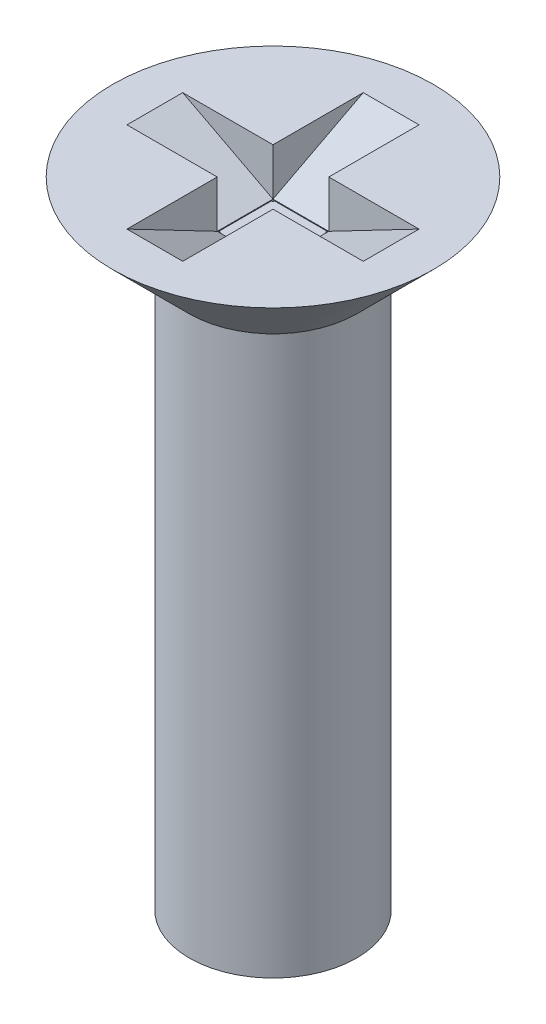
ISO-10303-21;
HEADER;
FILE_DESCRIPTION(('STEP AP214'),'2;1');
FILE_NAME('part.step','',(''),(''),'','','');
FILE_SCHEMA(('AUTOMOTIVE_DESIGN { 1 0 10303 214 1 1 1 1 }'));
ENDSEC;
DATA;
#1=APPLICATION_CONTEXT('core data for automotive mechanical design processes');
#2=APPLICATION_PROTOCOL_DEFINITION('international standard','automotive_design',2000,#1);
#3=PRODUCT_CONTEXT('',#1,'mechanical');
#4=PRODUCT('Part','Part','',(#3));
#5=PRODUCT_RELATED_PRODUCT_CATEGORY('part','',(#4));
#6=PRODUCT_DEFINITION_FORMATION('','',#4);
#7=PRODUCT_DEFINITION_CONTEXT('part definition',#1,'design');
#8=PRODUCT_DEFINITION('design','',#6,#7);
#9=PRODUCT_DEFINITION_SHAPE('','',#8);
#10=(LENGTH_UNIT() NAMED_UNIT(*) SI_UNIT(.MILLI.,.METRE.));
#11=(NAMED_UNIT(*) PLANE_ANGLE_UNIT() SI_UNIT($,.RADIAN.));
#12=(NAMED_UNIT(*) SI_UNIT($,.STERADIAN.) SOLID_ANGLE_UNIT());
#13=UNCERTAINTY_MEASURE_WITH_UNIT(LENGTH_MEASURE(1.E-05),#10,'distance_accuracy_value','');
#14=(GEOMETRIC_REPRESENTATION_CONTEXT(3) GLOBAL_UNCERTAINTY_ASSIGNED_CONTEXT((#13)) GLOBAL_UNIT_ASSIGNED_CONTEXT((#10,
#11,#12)) REPRESENTATION_CONTEXT('',''));
#15=CARTESIAN_POINT('',(0.,0.,0.));
#16=DIRECTION('',(0.,0.,1.));
#17=DIRECTION('',(1.,0.,0.));
#18=AXIS2_PLACEMENT_3D('',#15,#16,#17);
#19=CARTESIAN_POINT('',(-0.472629214597488,0.51696318340299,-0.5));
#20=DIRECTION('',(-0.462439307727369,-0.886650938458101,0.));
#21=DIRECTION('',(0.886650938458101,-0.462439307727369,0.));
#22=AXIS2_PLACEMENT_3D('',#19,#20,#21);
#23=PLANE('',#22);
#24=DIRECTION('',(0.,0.,-1.));
#25=VECTOR('',#24,1.);
#26=CARTESIAN_POINT('',(-0.499999999999995,0.53123861751633,0.499999999999978));
#27=LINE('',#26,#25);
#28=CARTESIAN_POINT('',(-0.499999999999995,0.531238617516331,0.5));
#29=VERTEX_POINT('',#28);
#30=CARTESIAN_POINT('',(-0.500000000000002,0.531238617516334,-0.500000000000001));
#31=VERTEX_POINT('',#30);
#32=EDGE_CURVE('E546',#29,#31,#27,.T.);
#33=ORIENTED_EDGE('',*,*,#32,.T.);
#34=DIRECTION('',(0.886650938458101,-0.462439307727369,0.));
#35=VECTOR('',#34,1.);
#36=CARTESIAN_POINT('',(-0.472629214597488,0.51696318340299,-0.5));
#37=LINE('',#36,#35);
#38=CARTESIAN_POINT('',(-2.11777299012585,1.37499999999998,-0.5));
#39=VERTEX_POINT('',#38);
#40=EDGE_CURVE('E495',#39,#31,#37,.T.);
#41=ORIENTED_EDGE('',*,*,#40,.F.);
#42=DIRECTION('',(0.,0.,1.));
#43=VECTOR('',#42,1.);
#44=CARTESIAN_POINT('',(-2.11777299012585,1.37499999999998,-0.5));
#45=LINE('',#44,#43);
#46=CARTESIAN_POINT('',(-2.11777299012585,1.37499999999999,0.5));
#47=VERTEX_POINT('',#46);
#48=EDGE_CURVE('E177',#39,#47,#45,.T.);
#49=ORIENTED_EDGE('',*,*,#48,.T.);
#50=DIRECTION('',(0.886650938458101,-0.462439307727369,0.));
#51=VECTOR('',#50,1.);
#52=CARTESIAN_POINT('',(-0.472629214597488,0.51696318340299,0.5));
#53=LINE('',#52,#51);
#54=EDGE_CURVE('E490',#47,#29,#53,.T.);
#55=ORIENTED_EDGE('',*,*,#54,.T.);
#56=EDGE_LOOP('',(#33,#41,#49,#55));
#57=FACE_BOUND('',#56,.T.);
#58=ADVANCED_FACE('F34',(#57),#23,.F.);
#59=CARTESIAN_POINT('',(0.,0.,-0.5));
#60=DIRECTION('',(0.,0.,1.));
#61=DIRECTION('',(1.,0.,0.));
#62=AXIS2_PLACEMENT_3D('',#59,#60,#61);
#63=PLANE('',#62);
#64=ORIENTED_EDGE('',*,*,#40,.T.);
#65=DIRECTION('',(0.,1.,0.));
#66=VECTOR('',#65,1.);
#67=CARTESIAN_POINT('',(-0.500000000000005,0.,-0.5));
#68=LINE('',#67,#66);
#69=CARTESIAN_POINT('',(-0.500000000000002,1.37499999999998,-0.499999999999999));
#70=VERTEX_POINT('',#69);
#71=EDGE_CURVE('E529',#31,#70,#68,.T.);
#72=ORIENTED_EDGE('',*,*,#71,.T.);
#73=DIRECTION('',(-1.,0.,0.));
#74=VECTOR('',#73,1.);
#75=CARTESIAN_POINT('',(-2.11777299012585,1.37499999999998,-0.5));
#76=LINE('',#75,#74);
#77=EDGE_CURVE('E169',#70,#39,#76,.T.);
#78=ORIENTED_EDGE('',*,*,#77,.T.);
#79=EDGE_LOOP('',(#64,#72,#78));
#80=FACE_BOUND('',#79,.T.);
#81=ADVANCED_FACE('F196',(#80),#63,.T.);
#82=DIRECTION('',(0.,1.,0.));
#83=VECTOR('',#82,1.);
#84=CARTESIAN_POINT('',(0.499999999999995,0.,-0.5));
#85=LINE('',#84,#83);
#86=CARTESIAN_POINT('',(0.499999999999995,0.53123861751633,-0.5));
#87=VERTEX_POINT('',#86);
#88=CARTESIAN_POINT('',(0.499999999999998,1.37499999999998,-0.499999999999999));
#89=VERTEX_POINT('',#88);
#90=EDGE_CURVE('E464',#87,#89,#85,.T.);
#91=ORIENTED_EDGE('',*,*,#90,.F.);
#92=DIRECTION('',(0.886650938458101,0.462439307727369,0.));
#93=VECTOR('',#92,1.);
#94=CARTESIAN_POINT('',(2.11777299012585,1.37499999999998,-0.5));
#95=LINE('',#94,#93);
#96=CARTESIAN_POINT('',(2.11777299012585,1.37499999999998,-0.5));
#97=VERTEX_POINT('',#96);
#98=EDGE_CURVE('E466',#87,#97,#95,.T.);
#99=ORIENTED_EDGE('',*,*,#98,.T.);
#100=EDGE_CURVE('E164',#97,#89,#76,.T.);
#101=ORIENTED_EDGE('',*,*,#100,.T.);
#102=EDGE_LOOP('',(#91,#99,#101));
#103=FACE_BOUND('',#102,.T.);
#104=ADVANCED_FACE('F203',(#103),#63,.T.);
#105=CARTESIAN_POINT('',(0.,0.,0.5));
#106=DIRECTION('',(0.,0.,1.));
#107=DIRECTION('',(1.,0.,0.));
#108=AXIS2_PLACEMENT_3D('',#105,#106,#107);
#109=PLANE('',#108);
#110=DIRECTION('',(0.,1.,0.));
#111=VECTOR('',#110,1.);
#112=CARTESIAN_POINT('',(-0.499999999999995,0.,0.5));
#113=LINE('',#112,#111);
#114=CARTESIAN_POINT('',(-0.499999999999994,1.37499999999998,0.5));
#115=VERTEX_POINT('',#114);
#116=EDGE_CURVE('E544',#29,#115,#113,.T.);
#117=ORIENTED_EDGE('',*,*,#116,.F.);
#118=ORIENTED_EDGE('',*,*,#54,.F.);
#119=DIRECTION('',(-1.,0.,0.));
#120=VECTOR('',#119,1.);
#121=CARTESIAN_POINT('',(-2.11777299012585,1.37499999999998,0.5));
#122=LINE('',#121,#120);
#123=EDGE_CURVE('E484',#115,#47,#122,.T.);
#124=ORIENTED_EDGE('',*,*,#123,.F.);
#125=EDGE_LOOP('',(#117,#118,#124));
#126=FACE_BOUND('',#125,.T.);
#127=ADVANCED_FACE('F247',(#126),#109,.F.);
#128=DIRECTION('',(0.886650938458101,0.462439307727369,0.));
#129=VECTOR('',#128,1.);
#130=CARTESIAN_POINT('',(2.11777299012585,1.37499999999998,0.5));
#131=LINE('',#130,#129);
#132=CARTESIAN_POINT('',(0.500000000000005,0.531238617516336,0.5));
#133=VERTEX_POINT('',#132);
#134=CARTESIAN_POINT('',(2.11777299012585,1.37499999999998,0.5));
#135=VERTEX_POINT('',#134);
#136=EDGE_CURVE('E474',#133,#135,#131,.T.);
#137=ORIENTED_EDGE('',*,*,#136,.F.);
#138=DIRECTION('',(0.,1.,0.));
#139=VECTOR('',#138,1.);
#140=CARTESIAN_POINT('',(0.500000000000005,0.,0.5));
#141=LINE('',#140,#139);
#142=CARTESIAN_POINT('',(0.500000000000002,1.37499999999998,0.5));
#143=VERTEX_POINT('',#142);
#144=EDGE_CURVE('E538',#133,#143,#141,.T.);
#145=ORIENTED_EDGE('',*,*,#144,.T.);
#146=EDGE_CURVE('E481',#135,#143,#122,.T.);
#147=ORIENTED_EDGE('',*,*,#146,.F.);
#148=EDGE_LOOP('',(#137,#145,#147));
#149=FACE_BOUND('',#148,.T.);
#150=ADVANCED_FACE('F248',(#149),#109,.F.);
#151=CARTESIAN_POINT('',(0.,1.37499999999999,0.));
#152=DIRECTION('',(0.,1.,0.));
#153=DIRECTION('',(0.,0.,1.));
#154=AXIS2_PLACEMENT_3D('',#151,#152,#153);
#155=PLANE('',#154);
#156=DIRECTION('',(0.,0.,1.));
#157=VECTOR('',#156,1.);
#158=CARTESIAN_POINT('',(0.500000000000007,1.37499999999998,2.11777299012585));
#159=LINE('',#158,#157);
#160=CARTESIAN_POINT('',(0.499999999999993,1.37499999999998,-2.11777299012586));
#161=VERTEX_POINT('',#160);
#162=EDGE_CURVE('E454',#161,#89,#159,.T.);
#163=ORIENTED_EDGE('',*,*,#162,.T.);
#164=ORIENTED_EDGE('',*,*,#100,.F.);
#165=DIRECTION('',(0.,0.,1.));
#166=VECTOR('',#165,1.);
#167=CARTESIAN_POINT('',(2.11777299012585,1.37499999999998,-0.5));
#168=LINE('',#167,#166);
#169=EDGE_CURVE('E472',#97,#135,#168,.T.);
#170=ORIENTED_EDGE('',*,*,#169,.T.);
#171=ORIENTED_EDGE('',*,*,#146,.T.);
#172=CARTESIAN_POINT('',(0.500000000000007,1.37499999999998,2.11777299012585));
#173=VERTEX_POINT('',#172);
#174=EDGE_CURVE('E461',#143,#173,#159,.T.);
#175=ORIENTED_EDGE('',*,*,#174,.T.);
#176=DIRECTION('',(1.,0.,0.));
#177=VECTOR('',#176,1.);
#178=CARTESIAN_POINT('',(-0.499999999999993,1.37499999999998,2.11777299012586));
#179=LINE('',#178,#177);
#180=CARTESIAN_POINT('',(-0.499999999999993,1.37499999999998,2.11777299012586));
#181=VERTEX_POINT('',#180);
#182=EDGE_CURVE('E501',#181,#173,#179,.T.);
#183=ORIENTED_EDGE('',*,*,#182,.F.);
#184=DIRECTION('',(0.,0.,1.));
#185=VECTOR('',#184,1.);
#186=CARTESIAN_POINT('',(-0.499999999999993,1.37499999999998,2.11777299012586));
#187=LINE('',#186,#185);
#188=EDGE_CURVE('E515',#115,#181,#187,.T.);
#189=ORIENTED_EDGE('',*,*,#188,.F.);
#190=ORIENTED_EDGE('',*,*,#123,.T.);
#191=ORIENTED_EDGE('',*,*,#48,.F.);
#192=ORIENTED_EDGE('',*,*,#77,.F.);
#193=CARTESIAN_POINT('',(-0.500000000000007,1.37499999999998,-2.11777299012585));
#194=VERTEX_POINT('',#193);
#195=EDGE_CURVE('E513',#194,#70,#187,.T.);
#196=ORIENTED_EDGE('',*,*,#195,.F.);
#197=DIRECTION('',(1.,0.,0.));
#198=VECTOR('',#197,1.);
#199=CARTESIAN_POINT('',(-0.500000000000007,1.37499999999998,-2.11777299012585));
#200=LINE('',#199,#198);
#201=EDGE_CURVE('E459',#194,#161,#200,.T.);
#202=ORIENTED_EDGE('',*,*,#201,.T.);
#203=EDGE_LOOP('',(#163,#164,#170,#171,#175,#183,#189,#190,#191,#192,#196,#202));
#204=FACE_BOUND('',#203,.T.);
#205=CARTESIAN_POINT('',(0.,1.37499999999998,0.));
#206=DIRECTION('',(0.,1.,0.));
#207=DIRECTION('',(0.,0.,1.));
#208=AXIS2_PLACEMENT_3D('',#205,#206,#207);
#209=CIRCLE('',#208,2.875);
#210=CARTESIAN_POINT('',(0.,1.37499999999998,2.875));
#211=VERTEX_POINT('',#210);
#212=EDGE_CURVE('E11',#211,#211,#209,.T.);
#213=ORIENTED_EDGE('',*,*,#212,.T.);
#214=EDGE_LOOP('',(#213));
#215=FACE_BOUND('',#214,.T.);
#216=ADVANCED_FACE('F193',(#204,#215),#155,.T.);
#217=CARTESIAN_POINT('',(0.,1.37499999999998,0.));
#218=DIRECTION('',(0.,1.,0.));
#219=DIRECTION('',(0.,0.,1.));
#220=AXIS2_PLACEMENT_3D('',#217,#218,#219);
#221=CONICAL_SURFACE('',#220,2.875,0.785398163397454);
#222=CARTESIAN_POINT('',(0.,0.,0.));
#223=DIRECTION('',(0.,1.,0.));
#224=DIRECTION('',(0.,0.,1.));
#225=AXIS2_PLACEMENT_3D('',#222,#223,#224);
#226=CIRCLE('',#225,1.5);
#227=CARTESIAN_POINT('',(0.,0.,1.5));
#228=VERTEX_POINT('',#227);
#229=EDGE_CURVE('E175',#228,#228,#226,.T.);
#230=ORIENTED_EDGE('',*,*,#229,.T.);
#231=EDGE_LOOP('',(#230));
#232=FACE_BOUND('',#231,.T.);
#233=ORIENTED_EDGE('',*,*,#212,.F.);
#234=EDGE_LOOP('',(#233));
#235=FACE_BOUND('',#234,.T.);
#236=ADVANCED_FACE('F36',(#232,#235),#221,.T.);
#237=CARTESIAN_POINT('',(-1.5,-10.,0.));
#238=DIRECTION('',(0.,-1.,0.));
#239=DIRECTION('',(0.,0.,-1.));
#240=AXIS2_PLACEMENT_3D('',#237,#238,#239);
#241=PLANE('',#240);
#242=CARTESIAN_POINT('',(0.,-10.,0.));
#243=DIRECTION('',(0.,1.,0.));
#244=DIRECTION('',(0.,0.,1.));
#245=AXIS2_PLACEMENT_3D('',#242,#243,#244);
#246=CIRCLE('',#245,1.5);
#247=CARTESIAN_POINT('',(0.,-10.,1.5));
#248=VERTEX_POINT('',#247);
#249=EDGE_CURVE('E42',#248,#248,#246,.T.);
#250=ORIENTED_EDGE('',*,*,#249,.F.);
#251=EDGE_LOOP('',(#250));
#252=FACE_BOUND('',#251,.T.);
#253=ADVANCED_FACE('F184',(#252),#241,.T.);
#254=CARTESIAN_POINT('',(0.,0.,0.));
#255=DIRECTION('',(0.,1.,0.));
#256=DIRECTION('',(0.,0.,1.));
#257=AXIS2_PLACEMENT_3D('',#254,#255,#256);
#258=CYLINDRICAL_SURFACE('',#257,1.5);
#259=ORIENTED_EDGE('',*,*,#249,.T.);
#260=EDGE_LOOP('',(#259));
#261=FACE_BOUND('',#260,.T.);
#262=ORIENTED_EDGE('',*,*,#229,.F.);
#263=EDGE_LOOP('',(#262));
#264=FACE_BOUND('',#263,.T.);
#265=ADVANCED_FACE('F181',(#261,#264),#258,.T.);
#266=CARTESIAN_POINT('',(2.11777299012585,1.37499999999998,-0.5));
#267=DIRECTION('',(0.462439307727369,-0.886650938458101,0.));
#268=DIRECTION('',(0.886650938458101,0.462439307727369,0.));
#269=AXIS2_PLACEMENT_3D('',#266,#267,#268);
#270=PLANE('',#269);
#271=ORIENTED_EDGE('',*,*,#98,.F.);
#272=DIRECTION('',(0.,0.,-1.));
#273=VECTOR('',#272,1.);
#274=CARTESIAN_POINT('',(0.500000000000005,0.531238617516336,0.5));
#275=LINE('',#274,#273);
#276=EDGE_CURVE('E541',#133,#87,#275,.T.);
#277=ORIENTED_EDGE('',*,*,#276,.F.);
#278=ORIENTED_EDGE('',*,*,#136,.T.);
#279=ORIENTED_EDGE('',*,*,#169,.F.);
#280=EDGE_LOOP('',(#271,#277,#278,#279));
#281=FACE_BOUND('',#280,.T.);
#282=ADVANCED_FACE('F191',(#281),#270,.F.);
#283=CARTESIAN_POINT('',(-0.499999999999998,0.51696318340299,0.47262921459749));
#284=DIRECTION('',(0.,-0.886650938458101,0.462439307727369));
#285=DIRECTION('',(0.,-0.462439307727369,-0.886650938458101));
#286=AXIS2_PLACEMENT_3D('',#283,#284,#285);
#287=PLANE('',#286);
#288=DIRECTION('',(0.,-0.462439307727369,-0.886650938458101));
#289=VECTOR('',#288,1.);
#290=CARTESIAN_POINT('',(-0.499999999999998,0.51696318340299,0.47262921459749));
#291=LINE('',#290,#289);
#292=EDGE_CURVE('E520',#181,#29,#291,.T.);
#293=ORIENTED_EDGE('',*,*,#292,.F.);
#294=ORIENTED_EDGE('',*,*,#182,.T.);
#295=DIRECTION('',(0.,-0.462439307727369,-0.886650938458101));
#296=VECTOR('',#295,1.);
#297=CARTESIAN_POINT('',(0.500000000000002,0.51696318340299,0.472629214597486));
#298=LINE('',#297,#296);
#299=EDGE_CURVE('E509',#173,#133,#298,.T.);
#300=ORIENTED_EDGE('',*,*,#299,.T.);
#301=DIRECTION('',(-1.,0.,0.));
#302=VECTOR('',#301,1.);
#303=CARTESIAN_POINT('',(0.,0.531238617516333,0.5));
#304=LINE('',#303,#302);
#305=EDGE_CURVE('E523',#133,#29,#304,.T.);
#306=ORIENTED_EDGE('',*,*,#305,.T.);
#307=EDGE_LOOP('',(#293,#294,#300,#306));
#308=FACE_BOUND('',#307,.T.);
#309=ADVANCED_FACE('F282',(#308),#287,.F.);
#310=CARTESIAN_POINT('',(-0.5,0.,0.));
#311=DIRECTION('',(1.,0.,0.));
#312=DIRECTION('',(0.,0.,-1.));
#313=AXIS2_PLACEMENT_3D('',#310,#311,#312);
#314=PLANE('',#313);
#315=ORIENTED_EDGE('',*,*,#116,.T.);
#316=ORIENTED_EDGE('',*,*,#188,.T.);
#317=ORIENTED_EDGE('',*,*,#292,.T.);
#318=EDGE_LOOP('',(#315,#316,#317));
#319=FACE_BOUND('',#318,.T.);
#320=ADVANCED_FACE('F264',(#319),#314,.T.);
#321=CARTESIAN_POINT('',(0.5,0.,0.));
#322=DIRECTION('',(1.,0.,0.));
#323=DIRECTION('',(0.,0.,-1.));
#324=AXIS2_PLACEMENT_3D('',#321,#322,#323);
#325=PLANE('',#324);
#326=ORIENTED_EDGE('',*,*,#299,.F.);
#327=ORIENTED_EDGE('',*,*,#174,.F.);
#328=ORIENTED_EDGE('',*,*,#144,.F.);
#329=EDGE_LOOP('',(#326,#327,#328));
#330=FACE_BOUND('',#329,.T.);
#331=ADVANCED_FACE('F303',(#330),#325,.F.);
#332=CARTESIAN_POINT('',(-0.500000000000007,1.37499999999998,-2.11777299012585));
#333=DIRECTION('',(0.,-0.886650938458101,-0.462439307727369));
#334=DIRECTION('',(0.,0.462439307727369,-0.886650938458101));
#335=AXIS2_PLACEMENT_3D('',#332,#333,#334);
#336=PLANE('',#335);
#337=DIRECTION('',(-1.,0.,0.));
#338=VECTOR('',#337,1.);
#339=CARTESIAN_POINT('',(0.,0.531238617516333,-0.5));
#340=LINE('',#339,#338);
#341=EDGE_CURVE('E526',#87,#31,#340,.T.);
#342=ORIENTED_EDGE('',*,*,#341,.F.);
#343=DIRECTION('',(0.,0.462439307727369,-0.886650938458101));
#344=VECTOR('',#343,1.);
#345=CARTESIAN_POINT('',(0.499999999999993,1.37499999999998,-2.11777299012586));
#346=LINE('',#345,#344);
#347=EDGE_CURVE('E505',#87,#161,#346,.T.);
#348=ORIENTED_EDGE('',*,*,#347,.T.);
#349=ORIENTED_EDGE('',*,*,#201,.F.);
#350=DIRECTION('',(0.,0.462439307727369,-0.886650938458101));
#351=VECTOR('',#350,1.);
#352=CARTESIAN_POINT('',(-0.500000000000007,1.37499999999998,-2.11777299012585));
#353=LINE('',#352,#351);
#354=EDGE_CURVE('E49',#31,#194,#353,.T.);
#355=ORIENTED_EDGE('',*,*,#354,.F.);
#356=EDGE_LOOP('',(#342,#348,#349,#355));
#357=FACE_BOUND('',#356,.T.);
#358=ADVANCED_FACE('F273',(#357),#336,.F.);
#359=ORIENTED_EDGE('',*,*,#354,.T.);
#360=ORIENTED_EDGE('',*,*,#195,.T.);
#361=ORIENTED_EDGE('',*,*,#71,.F.);
#362=EDGE_LOOP('',(#359,#360,#361));
#363=FACE_BOUND('',#362,.T.);
#364=ADVANCED_FACE('F265',(#363),#314,.T.);
#365=ORIENTED_EDGE('',*,*,#90,.T.);
#366=ORIENTED_EDGE('',*,*,#162,.F.);
#367=ORIENTED_EDGE('',*,*,#347,.F.);
#368=EDGE_LOOP('',(#365,#366,#367));
#369=FACE_BOUND('',#368,.T.);
#370=ADVANCED_FACE('F300',(#369),#325,.F.);
#371=ORIENTED_EDGE('',*,*,#276,.T.);
#372=CARTESIAN_POINT('',(0.499999999999998,0.51696318340299,-0.47262921459749));
#373=VERTEX_POINT('',#372);
#374=EDGE_CURVE('E503',#373,#87,#346,.T.);
#375=ORIENTED_EDGE('',*,*,#374,.F.);
#376=DIRECTION('',(0.,0.,-1.));
#377=VECTOR('',#376,1.);
#378=CARTESIAN_POINT('',(0.499999999999998,0.51696318340299,-0.47262921459749));
#379=LINE('',#378,#377);
#380=CARTESIAN_POINT('',(0.500000000000002,0.51696318340299,0.472629214597486));
#381=VERTEX_POINT('',#380);
#382=EDGE_CURVE('E506',#381,#373,#379,.T.);
#383=ORIENTED_EDGE('',*,*,#382,.F.);
#384=EDGE_CURVE('E512',#133,#381,#298,.T.);
#385=ORIENTED_EDGE('',*,*,#384,.F.);
#386=EDGE_LOOP('',(#371,#375,#383,#385));
#387=FACE_BOUND('',#386,.T.);
#388=ADVANCED_FACE('F294',(#387),#325,.F.);
#389=DIRECTION('',(-0.663427894457714,-0.346015689977808,-0.663427894457707));
#390=VECTOR('',#389,1.);
#391=CARTESIAN_POINT('',(0.484676098234086,0.523246324025239,0.484676098234081));
#392=LINE('',#391,#390);
#393=CARTESIAN_POINT('',(0.472629214597488,0.51696318340299,0.472629214597488));
#394=VERTEX_POINT('',#393);
#395=EDGE_CURVE('E57',#133,#394,#392,.T.);
#396=ORIENTED_EDGE('',*,*,#395,.F.);
#397=ORIENTED_EDGE('',*,*,#384,.T.);
#398=DIRECTION('',(1.,0.,0.));
#399=VECTOR('',#398,1.);
#400=CARTESIAN_POINT('',(-0.499999999999998,0.51696318340299,0.47262921459749));
#401=LINE('',#400,#399);
#402=EDGE_CURVE('E158',#394,#381,#401,.T.);
#403=ORIENTED_EDGE('',*,*,#402,.F.);
#404=EDGE_LOOP('',(#396,#397,#403));
#405=FACE_BOUND('',#404,.T.);
#406=ADVANCED_FACE('F281',(#405),#287,.F.);
#407=DIRECTION('',(0.663427894457708,0.346015689977805,-0.663427894457715));
#408=VECTOR('',#407,1.);
#409=CARTESIAN_POINT('',(0.04453952708949,0.293689863373928,-0.0445395270894905));
#410=LINE('',#409,#408);
#411=CARTESIAN_POINT('',(0.472629214597488,0.51696318340299,-0.472629214597489));
#412=VERTEX_POINT('',#411);
#413=EDGE_CURVE('E149',#412,#87,#410,.T.);
#414=ORIENTED_EDGE('',*,*,#413,.F.);
#415=DIRECTION('',(1.,0.,0.));
#416=VECTOR('',#415,1.);
#417=CARTESIAN_POINT('',(-0.500000000000002,0.51696318340299,-0.472629214597486));
#418=LINE('',#417,#416);
#419=EDGE_CURVE('E157',#412,#373,#418,.T.);
#420=ORIENTED_EDGE('',*,*,#419,.T.);
#421=ORIENTED_EDGE('',*,*,#374,.T.);
#422=EDGE_LOOP('',(#414,#420,#421));
#423=FACE_BOUND('',#422,.T.);
#424=ADVANCED_FACE('F274',(#423),#336,.F.);
#425=DIRECTION('',(-0.663427894457708,0.346015689977805,0.663427894457715));
#426=VECTOR('',#425,1.);
#427=CARTESIAN_POINT('',(-1.40573193336152,1.0036297582494,1.40573193336153));
#428=LINE('',#427,#426);
#429=CARTESIAN_POINT('',(-0.472629214597488,0.51696318340299,0.472629214597493));
#430=VERTEX_POINT('',#429);
#431=EDGE_CURVE('E138',#430,#29,#428,.T.);
#432=ORIENTED_EDGE('',*,*,#431,.F.);
#433=CARTESIAN_POINT('',(-0.499999999999998,0.51696318340299,0.47262921459749));
#434=VERTEX_POINT('',#433);
#435=EDGE_CURVE('E141',#434,#430,#401,.T.);
#436=ORIENTED_EDGE('',*,*,#435,.F.);
#437=EDGE_CURVE('E143',#29,#434,#291,.T.);
#438=ORIENTED_EDGE('',*,*,#437,.F.);
#439=EDGE_LOOP('',(#432,#436,#438));
#440=FACE_BOUND('',#439,.T.);
#441=ADVANCED_FACE('F140',(#440),#287,.F.);
#442=DIRECTION('',(0.663427894457714,-0.346015689977808,0.663427894457707));
#443=VECTOR('',#442,1.);
#444=CARTESIAN_POINT('',(-0.965595362216948,0.774073297598108,-0.965595362216937));
#445=LINE('',#444,#443);
#446=CARTESIAN_POINT('',(-0.472629214597488,0.51696318340299,-0.472629214597488));
#447=VERTEX_POINT('',#446);
#448=EDGE_CURVE('E535',#31,#447,#445,.T.);
#449=ORIENTED_EDGE('',*,*,#448,.F.);
#450=CARTESIAN_POINT('',(-0.500000000000002,0.51696318340299,-0.472629214597486));
#451=VERTEX_POINT('',#450);
#452=EDGE_CURVE('E516',#451,#31,#353,.T.);
#453=ORIENTED_EDGE('',*,*,#452,.F.);
#454=EDGE_CURVE('E498',#451,#447,#418,.T.);
#455=ORIENTED_EDGE('',*,*,#454,.T.);
#456=EDGE_LOOP('',(#449,#453,#455));
#457=FACE_BOUND('',#456,.T.);
#458=ADVANCED_FACE('F261',(#457),#336,.F.);
#459=ORIENTED_EDGE('',*,*,#437,.T.);
#460=DIRECTION('',(0.,0.,-1.));
#461=VECTOR('',#460,1.);
#462=CARTESIAN_POINT('',(-0.500000000000002,0.51696318340299,-0.472629214597486));
#463=LINE('',#462,#461);
#464=EDGE_CURVE('E156',#434,#451,#463,.T.);
#465=ORIENTED_EDGE('',*,*,#464,.T.);
#466=ORIENTED_EDGE('',*,*,#452,.T.);
#467=ORIENTED_EDGE('',*,*,#32,.F.);
#468=EDGE_LOOP('',(#459,#465,#466,#467));
#469=FACE_BOUND('',#468,.T.);
#470=ADVANCED_FACE('F254',(#469),#314,.T.);
#471=ORIENTED_EDGE('',*,*,#341,.T.);
#472=CARTESIAN_POINT('',(-0.472629214597488,0.51696318340299,-0.5));
#473=VERTEX_POINT('',#472);
#474=EDGE_CURVE('E483',#31,#473,#37,.T.);
#475=ORIENTED_EDGE('',*,*,#474,.T.);
#476=DIRECTION('',(1.,0.,0.));
#477=VECTOR('',#476,1.);
#478=CARTESIAN_POINT('',(0.472629214597488,0.51696318340299,-0.5));
#479=LINE('',#478,#477);
#480=CARTESIAN_POINT('',(0.472629214597488,0.51696318340299,-0.5));
#481=VERTEX_POINT('',#480);
#482=EDGE_CURVE('E470',#473,#481,#479,.T.);
#483=ORIENTED_EDGE('',*,*,#482,.T.);
#484=EDGE_CURVE('E469',#481,#87,#95,.T.);
#485=ORIENTED_EDGE('',*,*,#484,.T.);
#486=EDGE_LOOP('',(#471,#475,#483,#485));
#487=FACE_BOUND('',#486,.T.);
#488=ADVANCED_FACE('F206',(#487),#63,.T.);
#489=CARTESIAN_POINT('',(-0.472629214597488,0.51696318340299,0.5));
#490=VERTEX_POINT('',#489);
#491=EDGE_CURVE('E161',#29,#490,#53,.T.);
#492=ORIENTED_EDGE('',*,*,#491,.F.);
#493=ORIENTED_EDGE('',*,*,#305,.F.);
#494=CARTESIAN_POINT('',(0.472629214597488,0.51696318340299,0.5));
#495=VERTEX_POINT('',#494);
#496=EDGE_CURVE('E485',#495,#133,#131,.T.);
#497=ORIENTED_EDGE('',*,*,#496,.F.);
#498=DIRECTION('',(1.,0.,0.));
#499=VECTOR('',#498,1.);
#500=CARTESIAN_POINT('',(0.472629214597488,0.51696318340299,0.5));
#501=LINE('',#500,#499);
#502=EDGE_CURVE('E488',#490,#495,#501,.T.);
#503=ORIENTED_EDGE('',*,*,#502,.F.);
#504=EDGE_LOOP('',(#492,#493,#497,#503));
#505=FACE_BOUND('',#504,.T.);
#506=ADVANCED_FACE('F239',(#505),#109,.F.);
#507=CARTESIAN_POINT('',(0.472629214597488,0.51696318340299,-0.5));
#508=DIRECTION('',(0.,-1.,0.));
#509=DIRECTION('',(0.,0.,-1.));
#510=AXIS2_PLACEMENT_3D('',#507,#508,#509);
#511=PLANE('',#510);
#512=ORIENTED_EDGE('',*,*,#502,.T.);
#513=DIRECTION('',(0.,0.,1.));
#514=VECTOR('',#513,1.);
#515=CARTESIAN_POINT('',(0.472629214597488,0.51696318340299,-0.5));
#516=LINE('',#515,#514);
#517=EDGE_CURVE('E167',#394,#495,#516,.T.);
#518=ORIENTED_EDGE('',*,*,#517,.F.);
#519=ORIENTED_EDGE('',*,*,#402,.T.);
#520=ORIENTED_EDGE('',*,*,#382,.T.);
#521=ORIENTED_EDGE('',*,*,#419,.F.);
#522=EDGE_CURVE('E173',#481,#412,#516,.T.);
#523=ORIENTED_EDGE('',*,*,#522,.F.);
#524=ORIENTED_EDGE('',*,*,#482,.F.);
#525=DIRECTION('',(0.,0.,1.));
#526=VECTOR('',#525,1.);
#527=CARTESIAN_POINT('',(-0.472629214597488,0.51696318340299,-0.5));
#528=LINE('',#527,#526);
#529=EDGE_CURVE('E163',#473,#447,#528,.T.);
#530=ORIENTED_EDGE('',*,*,#529,.T.);
#531=ORIENTED_EDGE('',*,*,#454,.F.);
#532=ORIENTED_EDGE('',*,*,#464,.F.);
#533=ORIENTED_EDGE('',*,*,#435,.T.);
#534=EDGE_CURVE('E154',#430,#490,#528,.T.);
#535=ORIENTED_EDGE('',*,*,#534,.T.);
#536=EDGE_LOOP('',(#512,#518,#519,#520,#521,#523,#524,#530,#531,#532,#533,#535));
#537=FACE_BOUND('',#536,.T.);
#538=ADVANCED_FACE('F153',(#537),#511,.F.);
#539=ORIENTED_EDGE('',*,*,#496,.T.);
#540=ORIENTED_EDGE('',*,*,#395,.T.);
#541=ORIENTED_EDGE('',*,*,#517,.T.);
#542=EDGE_LOOP('',(#539,#540,#541));
#543=FACE_BOUND('',#542,.T.);
#544=ADVANCED_FACE('F225',(#543),#270,.F.);
#545=ORIENTED_EDGE('',*,*,#522,.T.);
#546=ORIENTED_EDGE('',*,*,#413,.T.);
#547=ORIENTED_EDGE('',*,*,#484,.F.);
#548=EDGE_LOOP('',(#545,#546,#547));
#549=FACE_BOUND('',#548,.T.);
#550=ADVANCED_FACE('F210',(#549),#270,.F.);
#551=ORIENTED_EDGE('',*,*,#474,.F.);
#552=ORIENTED_EDGE('',*,*,#448,.T.);
#553=ORIENTED_EDGE('',*,*,#529,.F.);
#554=EDGE_LOOP('',(#551,#552,#553));
#555=FACE_BOUND('',#554,.T.);
#556=ADVANCED_FACE('F199',(#555),#23,.F.);
#557=ORIENTED_EDGE('',*,*,#534,.F.);
#558=ORIENTED_EDGE('',*,*,#431,.T.);
#559=ORIENTED_EDGE('',*,*,#491,.T.);
#560=EDGE_LOOP('',(#557,#558,#559));
#561=FACE_BOUND('',#560,.T.);
#562=ADVANCED_FACE('F160',(#561),#23,.F.);
#563=CLOSED_SHELL('',(#58,#81,#104,#127,#150,#216,#236,#253,#265,#282,#309,#320,#331,#358,#364,
#370,#388,#406,#424,#441,#458,#470,#488,#506,#538,#544,#550,#556,#562));
#564=MANIFOLD_SOLID_BREP('B2',#563);
#565=ADVANCED_BREP_SHAPE_REPRESENTATION('',(#18,#564),#14);
#566=SHAPE_DEFINITION_REPRESENTATION(#9,#565);
ENDSEC;
END-ISO-10303-21;
